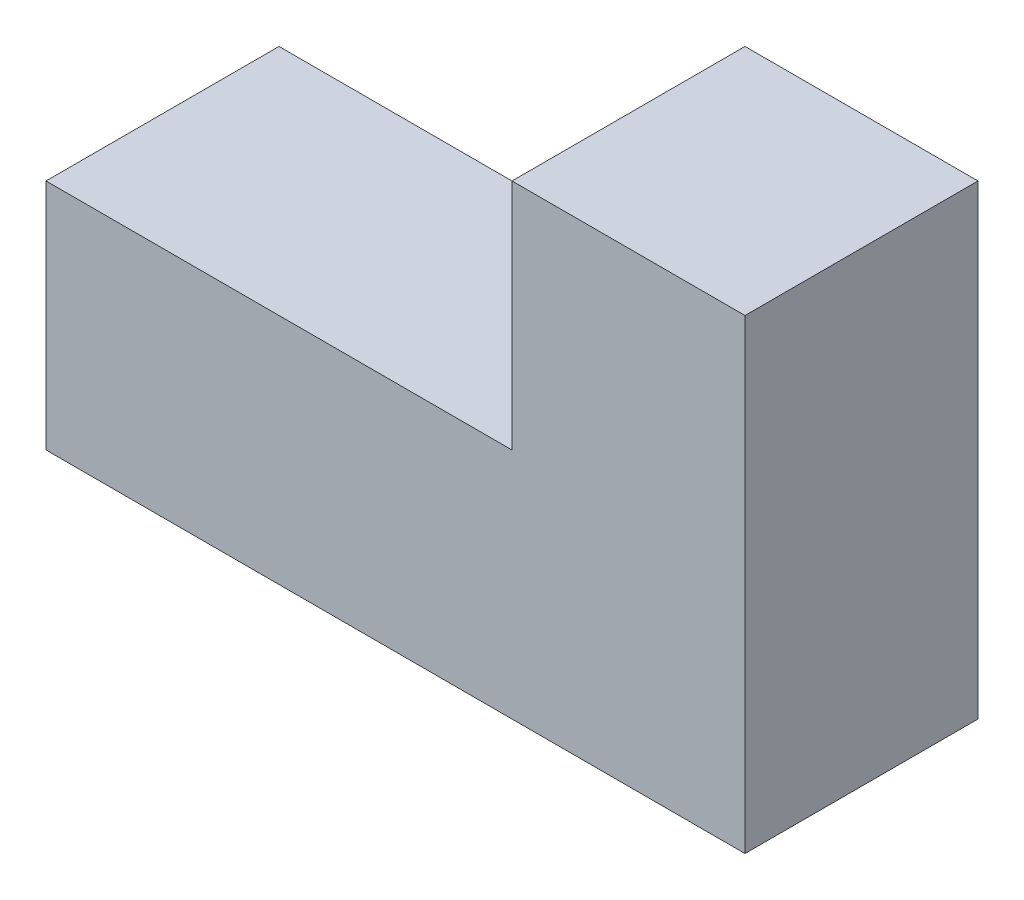
ISO-10303-21;
HEADER;
FILE_DESCRIPTION(('STEP AP214'),'2;1');
FILE_NAME('part.step','',(''),(''),'','','');
FILE_SCHEMA(('AUTOMOTIVE_DESIGN { 1 0 10303 214 1 1 1 1 }'));
ENDSEC;
DATA;
#1=APPLICATION_CONTEXT('core data for automotive mechanical design processes');
#2=APPLICATION_PROTOCOL_DEFINITION('international standard','automotive_design',2000,#1);
#3=PRODUCT_CONTEXT('',#1,'mechanical');
#4=PRODUCT('Part','Part','',(#3));
#5=PRODUCT_RELATED_PRODUCT_CATEGORY('part','',(#4));
#6=PRODUCT_DEFINITION_FORMATION('','',#4);
#7=PRODUCT_DEFINITION_CONTEXT('part definition',#1,'design');
#8=PRODUCT_DEFINITION('design','',#6,#7);
#9=PRODUCT_DEFINITION_SHAPE('','',#8);
#10=(LENGTH_UNIT() NAMED_UNIT(*) SI_UNIT(.MILLI.,.METRE.));
#11=(NAMED_UNIT(*) PLANE_ANGLE_UNIT() SI_UNIT($,.RADIAN.));
#12=(NAMED_UNIT(*) SI_UNIT($,.STERADIAN.) SOLID_ANGLE_UNIT());
#13=UNCERTAINTY_MEASURE_WITH_UNIT(LENGTH_MEASURE(1.E-05),#10,'distance_accuracy_value','');
#14=(GEOMETRIC_REPRESENTATION_CONTEXT(3) GLOBAL_UNCERTAINTY_ASSIGNED_CONTEXT((#13)) GLOBAL_UNIT_ASSIGNED_CONTEXT((#10,
#11,#12)) REPRESENTATION_CONTEXT('',''));
#15=CARTESIAN_POINT('',(0.,0.,0.));
#16=DIRECTION('',(0.,0.,1.));
#17=DIRECTION('',(1.,0.,0.));
#18=AXIS2_PLACEMENT_3D('',#15,#16,#17);
#19=CARTESIAN_POINT('',(0.,30.,-15.));
#20=DIRECTION('',(-1.,0.,0.));
#21=DIRECTION('',(0.,0.,1.));
#22=AXIS2_PLACEMENT_3D('',#19,#20,#21);
#23=PLANE('',#22);
#24=DIRECTION('',(0.,0.,1.));
#25=VECTOR('',#24,1.);
#26=CARTESIAN_POINT('',(0.,0.,-15.));
#27=LINE('',#26,#25);
#28=CARTESIAN_POINT('',(0.,0.,-15.));
#29=VERTEX_POINT('',#28);
#30=CARTESIAN_POINT('',(0.,0.,15.));
#31=VERTEX_POINT('',#30);
#32=EDGE_CURVE('E36',#29,#31,#27,.T.);
#33=ORIENTED_EDGE('',*,*,#32,.T.);
#34=DIRECTION('',(0.,-1.,0.));
#35=VECTOR('',#34,1.);
#36=CARTESIAN_POINT('',(0.,30.,15.));
#37=LINE('',#36,#35);
#38=CARTESIAN_POINT('',(0.,30.,15.));
#39=VERTEX_POINT('',#38);
#40=EDGE_CURVE('E85',#39,#31,#37,.T.);
#41=ORIENTED_EDGE('',*,*,#40,.F.);
#42=DIRECTION('',(0.,0.,1.));
#43=VECTOR('',#42,1.);
#44=CARTESIAN_POINT('',(0.,30.,-15.));
#45=LINE('',#44,#43);
#46=CARTESIAN_POINT('',(0.,30.,-15.));
#47=VERTEX_POINT('',#46);
#48=EDGE_CURVE('E11',#47,#39,#45,.T.);
#49=ORIENTED_EDGE('',*,*,#48,.F.);
#50=DIRECTION('',(0.,-1.,0.));
#51=VECTOR('',#50,1.);
#52=CARTESIAN_POINT('',(0.,30.,-15.));
#53=LINE('',#52,#51);
#54=EDGE_CURVE('E86',#47,#29,#53,.T.);
#55=ORIENTED_EDGE('',*,*,#54,.T.);
#56=EDGE_LOOP('',(#33,#41,#49,#55));
#57=FACE_BOUND('',#56,.T.);
#58=ADVANCED_FACE('F33',(#57),#23,.T.);
#59=CARTESIAN_POINT('',(60.,30.,-15.));
#60=DIRECTION('',(0.,1.,0.));
#61=DIRECTION('',(0.,0.,1.));
#62=AXIS2_PLACEMENT_3D('',#59,#60,#61);
#63=PLANE('',#62);
#64=ORIENTED_EDGE('',*,*,#48,.T.);
#65=DIRECTION('',(-1.,0.,0.));
#66=VECTOR('',#65,1.);
#67=CARTESIAN_POINT('',(60.,30.,15.));
#68=LINE('',#67,#66);
#69=CARTESIAN_POINT('',(60.,30.,15.));
#70=VERTEX_POINT('',#69);
#71=EDGE_CURVE('E103',#70,#39,#68,.T.);
#72=ORIENTED_EDGE('',*,*,#71,.F.);
#73=DIRECTION('',(0.,0.,1.));
#74=VECTOR('',#73,1.);
#75=CARTESIAN_POINT('',(60.,30.,-15.));
#76=LINE('',#75,#74);
#77=CARTESIAN_POINT('',(60.,30.,-15.));
#78=VERTEX_POINT('',#77);
#79=EDGE_CURVE('E41',#78,#70,#76,.T.);
#80=ORIENTED_EDGE('',*,*,#79,.F.);
#81=DIRECTION('',(-1.,0.,0.));
#82=VECTOR('',#81,1.);
#83=CARTESIAN_POINT('',(60.,30.,-15.));
#84=LINE('',#83,#82);
#85=EDGE_CURVE('E91',#78,#47,#84,.T.);
#86=ORIENTED_EDGE('',*,*,#85,.T.);
#87=EDGE_LOOP('',(#64,#72,#80,#86));
#88=FACE_BOUND('',#87,.T.);
#89=ADVANCED_FACE('F143',(#88),#63,.T.);
#90=CARTESIAN_POINT('',(60.,60.,-15.));
#91=DIRECTION('',(-1.,0.,0.));
#92=DIRECTION('',(0.,0.,1.));
#93=AXIS2_PLACEMENT_3D('',#90,#91,#92);
#94=PLANE('',#93);
#95=ORIENTED_EDGE('',*,*,#79,.T.);
#96=DIRECTION('',(0.,-1.,0.));
#97=VECTOR('',#96,1.);
#98=CARTESIAN_POINT('',(60.,60.,15.));
#99=LINE('',#98,#97);
#100=CARTESIAN_POINT('',(60.,60.,15.));
#101=VERTEX_POINT('',#100);
#102=EDGE_CURVE('E110',#101,#70,#99,.T.);
#103=ORIENTED_EDGE('',*,*,#102,.F.);
#104=DIRECTION('',(0.,0.,1.));
#105=VECTOR('',#104,1.);
#106=CARTESIAN_POINT('',(60.,60.,-15.));
#107=LINE('',#106,#105);
#108=CARTESIAN_POINT('',(60.,60.,-15.));
#109=VERTEX_POINT('',#108);
#110=EDGE_CURVE('E126',#109,#101,#107,.T.);
#111=ORIENTED_EDGE('',*,*,#110,.F.);
#112=DIRECTION('',(0.,-1.,0.));
#113=VECTOR('',#112,1.);
#114=CARTESIAN_POINT('',(60.,60.,-15.));
#115=LINE('',#114,#113);
#116=EDGE_CURVE('E122',#109,#78,#115,.T.);
#117=ORIENTED_EDGE('',*,*,#116,.T.);
#118=EDGE_LOOP('',(#95,#103,#111,#117));
#119=FACE_BOUND('',#118,.T.);
#120=ADVANCED_FACE('F139',(#119),#94,.T.);
#121=CARTESIAN_POINT('',(90.,60.,-15.));
#122=DIRECTION('',(0.,1.,0.));
#123=DIRECTION('',(0.,0.,1.));
#124=AXIS2_PLACEMENT_3D('',#121,#122,#123);
#125=PLANE('',#124);
#126=ORIENTED_EDGE('',*,*,#110,.T.);
#127=DIRECTION('',(-1.,0.,0.));
#128=VECTOR('',#127,1.);
#129=CARTESIAN_POINT('',(90.,60.,15.));
#130=LINE('',#129,#128);
#131=CARTESIAN_POINT('',(90.,60.,15.));
#132=VERTEX_POINT('',#131);
#133=EDGE_CURVE('E107',#132,#101,#130,.T.);
#134=ORIENTED_EDGE('',*,*,#133,.F.);
#135=DIRECTION('',(0.,0.,1.));
#136=VECTOR('',#135,1.);
#137=CARTESIAN_POINT('',(90.,60.,-15.));
#138=LINE('',#137,#136);
#139=CARTESIAN_POINT('',(90.,60.,-15.));
#140=VERTEX_POINT('',#139);
#141=EDGE_CURVE('E128',#140,#132,#138,.T.);
#142=ORIENTED_EDGE('',*,*,#141,.F.);
#143=DIRECTION('',(-1.,0.,0.));
#144=VECTOR('',#143,1.);
#145=CARTESIAN_POINT('',(90.,60.,-15.));
#146=LINE('',#145,#144);
#147=EDGE_CURVE('E119',#140,#109,#146,.T.);
#148=ORIENTED_EDGE('',*,*,#147,.T.);
#149=EDGE_LOOP('',(#126,#134,#142,#148));
#150=FACE_BOUND('',#149,.T.);
#151=ADVANCED_FACE('F136',(#150),#125,.T.);
#152=CARTESIAN_POINT('',(90.,0.,-15.));
#153=DIRECTION('',(1.,0.,0.));
#154=DIRECTION('',(0.,0.,-1.));
#155=AXIS2_PLACEMENT_3D('',#152,#153,#154);
#156=PLANE('',#155);
#157=ORIENTED_EDGE('',*,*,#141,.T.);
#158=DIRECTION('',(0.,1.,0.));
#159=VECTOR('',#158,1.);
#160=CARTESIAN_POINT('',(90.,0.,15.));
#161=LINE('',#160,#159);
#162=CARTESIAN_POINT('',(90.,0.,15.));
#163=VERTEX_POINT('',#162);
#164=EDGE_CURVE('E98',#163,#132,#161,.T.);
#165=ORIENTED_EDGE('',*,*,#164,.F.);
#166=DIRECTION('',(0.,0.,1.));
#167=VECTOR('',#166,1.);
#168=CARTESIAN_POINT('',(90.,0.,-15.));
#169=LINE('',#168,#167);
#170=CARTESIAN_POINT('',(90.,0.,-15.));
#171=VERTEX_POINT('',#170);
#172=EDGE_CURVE('E90',#171,#163,#169,.T.);
#173=ORIENTED_EDGE('',*,*,#172,.F.);
#174=DIRECTION('',(0.,1.,0.));
#175=VECTOR('',#174,1.);
#176=CARTESIAN_POINT('',(90.,0.,-15.));
#177=LINE('',#176,#175);
#178=EDGE_CURVE('E116',#171,#140,#177,.T.);
#179=ORIENTED_EDGE('',*,*,#178,.T.);
#180=EDGE_LOOP('',(#157,#165,#173,#179));
#181=FACE_BOUND('',#180,.T.);
#182=ADVANCED_FACE('F130',(#181),#156,.T.);
#183=CARTESIAN_POINT('',(0.,0.,-15.));
#184=DIRECTION('',(0.,-1.,0.));
#185=DIRECTION('',(0.,0.,-1.));
#186=AXIS2_PLACEMENT_3D('',#183,#184,#185);
#187=PLANE('',#186);
#188=ORIENTED_EDGE('',*,*,#172,.T.);
#189=DIRECTION('',(1.,0.,0.));
#190=VECTOR('',#189,1.);
#191=CARTESIAN_POINT('',(0.,0.,15.));
#192=LINE('',#191,#190);
#193=EDGE_CURVE('E93',#31,#163,#192,.T.);
#194=ORIENTED_EDGE('',*,*,#193,.F.);
#195=ORIENTED_EDGE('',*,*,#32,.F.);
#196=DIRECTION('',(1.,0.,0.));
#197=VECTOR('',#196,1.);
#198=CARTESIAN_POINT('',(0.,0.,-15.));
#199=LINE('',#198,#197);
#200=EDGE_CURVE('E114',#29,#171,#199,.T.);
#201=ORIENTED_EDGE('',*,*,#200,.T.);
#202=EDGE_LOOP('',(#188,#194,#195,#201));
#203=FACE_BOUND('',#202,.T.);
#204=ADVANCED_FACE('F94',(#203),#187,.T.);
#205=CARTESIAN_POINT('',(0.,0.,-15.));
#206=DIRECTION('',(0.,0.,1.));
#207=DIRECTION('',(1.,0.,0.));
#208=AXIS2_PLACEMENT_3D('',#205,#206,#207);
#209=PLANE('',#208);
#210=ORIENTED_EDGE('',*,*,#54,.F.);
#211=ORIENTED_EDGE('',*,*,#85,.F.);
#212=ORIENTED_EDGE('',*,*,#116,.F.);
#213=ORIENTED_EDGE('',*,*,#147,.F.);
#214=ORIENTED_EDGE('',*,*,#178,.F.);
#215=ORIENTED_EDGE('',*,*,#200,.F.);
#216=EDGE_LOOP('',(#210,#211,#212,#213,#214,#215));
#217=FACE_BOUND('',#216,.T.);
#218=ADVANCED_FACE('F142',(#217),#209,.F.);
#219=CARTESIAN_POINT('',(0.,0.,15.));
#220=DIRECTION('',(0.,0.,1.));
#221=DIRECTION('',(1.,0.,0.));
#222=AXIS2_PLACEMENT_3D('',#219,#220,#221);
#223=PLANE('',#222);
#224=ORIENTED_EDGE('',*,*,#40,.T.);
#225=ORIENTED_EDGE('',*,*,#193,.T.);
#226=ORIENTED_EDGE('',*,*,#164,.T.);
#227=ORIENTED_EDGE('',*,*,#133,.T.);
#228=ORIENTED_EDGE('',*,*,#102,.T.);
#229=ORIENTED_EDGE('',*,*,#71,.T.);
#230=EDGE_LOOP('',(#224,#225,#226,#227,#228,#229));
#231=FACE_BOUND('',#230,.T.);
#232=ADVANCED_FACE('F101',(#231),#223,.T.);
#233=CLOSED_SHELL('',(#58,#89,#120,#151,#182,#204,#218,#232));
#234=MANIFOLD_SOLID_BREP('B2',#233);
#235=ADVANCED_BREP_SHAPE_REPRESENTATION('',(#18,#234),#14);
#236=SHAPE_DEFINITION_REPRESENTATION(#9,#235);
ENDSEC;
END-ISO-10303-21;
